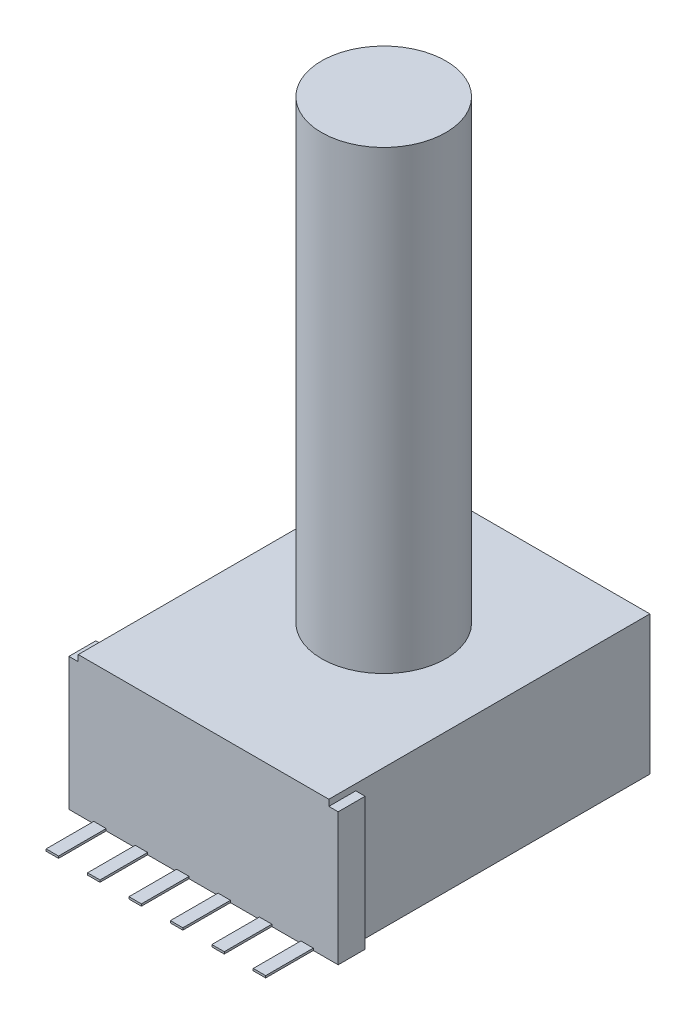
ISO-10303-21;
HEADER;
FILE_DESCRIPTION(('STEP AP214'),'2;1');
FILE_NAME('part.step','',(''),(''),'','','');
FILE_SCHEMA(('AUTOMOTIVE_DESIGN { 1 0 10303 214 1 1 1 1 }'));
ENDSEC;
DATA;
#1=APPLICATION_CONTEXT('core data for automotive mechanical design processes');
#2=APPLICATION_PROTOCOL_DEFINITION('international standard','automotive_design',2000,#1);
#3=PRODUCT_CONTEXT('',#1,'mechanical');
#4=PRODUCT('Part','Part','',(#3));
#5=PRODUCT_RELATED_PRODUCT_CATEGORY('part','',(#4));
#6=PRODUCT_DEFINITION_FORMATION('','',#4);
#7=PRODUCT_DEFINITION_CONTEXT('part definition',#1,'design');
#8=PRODUCT_DEFINITION('design','',#6,#7);
#9=PRODUCT_DEFINITION_SHAPE('','',#8);
#10=(LENGTH_UNIT() NAMED_UNIT(*) SI_UNIT(.MILLI.,.METRE.));
#11=(NAMED_UNIT(*) PLANE_ANGLE_UNIT() SI_UNIT($,.RADIAN.));
#12=(NAMED_UNIT(*) SI_UNIT($,.STERADIAN.) SOLID_ANGLE_UNIT());
#13=UNCERTAINTY_MEASURE_WITH_UNIT(LENGTH_MEASURE(1.E-05),#10,'distance_accuracy_value','');
#14=(GEOMETRIC_REPRESENTATION_CONTEXT(3) GLOBAL_UNCERTAINTY_ASSIGNED_CONTEXT((#13)) GLOBAL_UNIT_ASSIGNED_CONTEXT((#10,
#11,#12)) REPRESENTATION_CONTEXT('',''));
#15=CARTESIAN_POINT('',(0.,0.,0.));
#16=DIRECTION('',(0.,0.,1.));
#17=DIRECTION('',(1.,0.,0.));
#18=AXIS2_PLACEMENT_3D('',#15,#16,#17);
#19=CARTESIAN_POINT('',(6.05,6.7,8.7));
#20=DIRECTION('',(0.,1.,0.));
#21=DIRECTION('',(0.,0.,1.));
#22=AXIS2_PLACEMENT_3D('',#19,#20,#21);
#23=PLANE('',#22);
#24=DIRECTION('',(0.,0.,-1.));
#25=VECTOR('',#24,1.);
#26=CARTESIAN_POINT('',(6.05,6.7,-6.8));
#27=LINE('',#26,#25);
#28=CARTESIAN_POINT('',(6.05,6.7,8.7));
#29=VERTEX_POINT('',#28);
#30=CARTESIAN_POINT('',(6.05,6.7,-6.8));
#31=VERTEX_POINT('',#30);
#32=EDGE_CURVE('E481',#29,#31,#27,.T.);
#33=ORIENTED_EDGE('',*,*,#32,.T.);
#34=DIRECTION('',(-1.,0.,0.));
#35=VECTOR('',#34,1.);
#36=CARTESIAN_POINT('',(-6.05,6.7,-6.8));
#37=LINE('',#36,#35);
#38=CARTESIAN_POINT('',(-6.05,6.7,-6.8));
#39=VERTEX_POINT('',#38);
#40=EDGE_CURVE('E479',#31,#39,#37,.T.);
#41=ORIENTED_EDGE('',*,*,#40,.T.);
#42=DIRECTION('',(0.,0.,1.));
#43=VECTOR('',#42,1.);
#44=CARTESIAN_POINT('',(-6.05,6.7,-6.8));
#45=LINE('',#44,#43);
#46=CARTESIAN_POINT('',(-6.05,6.7,8.7));
#47=VERTEX_POINT('',#46);
#48=EDGE_CURVE('E477',#39,#47,#45,.T.);
#49=ORIENTED_EDGE('',*,*,#48,.T.);
#50=DIRECTION('',(1.,0.,0.));
#51=VECTOR('',#50,1.);
#52=CARTESIAN_POINT('',(-6.05,6.7,8.7));
#53=LINE('',#52,#51);
#54=EDGE_CURVE('E475',#47,#29,#53,.T.);
#55=ORIENTED_EDGE('',*,*,#54,.T.);
#56=EDGE_LOOP('',(#33,#41,#49,#55));
#57=FACE_BOUND('',#56,.T.);
#58=CARTESIAN_POINT('',(0.,6.7,0.));
#59=DIRECTION('',(0.,1.,0.));
#60=DIRECTION('',(0.,0.,1.));
#61=AXIS2_PLACEMENT_3D('',#58,#59,#60);
#62=CIRCLE('',#61,3.);
#63=CARTESIAN_POINT('',(0.,6.7,3.));
#64=VERTEX_POINT('',#63);
#65=EDGE_CURVE('E874',#64,#64,#62,.T.);
#66=ORIENTED_EDGE('',*,*,#65,.F.);
#67=EDGE_LOOP('',(#66));
#68=FACE_BOUND('',#67,.T.);
#69=ADVANCED_FACE('F30',(#57,#68),#23,.T.);
#70=CARTESIAN_POINT('',(-6.05,6.7,8.7));
#71=DIRECTION('',(0.,0.,-1.));
#72=DIRECTION('',(-1.,0.,0.));
#73=AXIS2_PLACEMENT_3D('',#70,#71,#72);
#74=PLANE('',#73);
#75=DIRECTION('',(0.,-1.,0.));
#76=VECTOR('',#75,1.);
#77=CARTESIAN_POINT('',(0.700000000000003,0.1,8.7));
#78=LINE('',#77,#76);
#79=CARTESIAN_POINT('',(0.700000000000002,0.1,8.7));
#80=VERTEX_POINT('',#79);
#81=CARTESIAN_POINT('',(0.700000000000003,0.,8.7));
#82=VERTEX_POINT('',#81);
#83=EDGE_CURVE('E53',#80,#82,#78,.T.);
#84=ORIENTED_EDGE('',*,*,#83,.F.);
#85=DIRECTION('',(-1.,0.,0.));
#86=VECTOR('',#85,1.);
#87=CARTESIAN_POINT('',(1.3,0.1,8.7));
#88=LINE('',#87,#86);
#89=CARTESIAN_POINT('',(1.3,0.1,8.7));
#90=VERTEX_POINT('',#89);
#91=EDGE_CURVE('E48',#90,#80,#88,.T.);
#92=ORIENTED_EDGE('',*,*,#91,.F.);
#93=DIRECTION('',(0.,-1.,0.));
#94=VECTOR('',#93,1.);
#95=CARTESIAN_POINT('',(1.3,0.1,8.7));
#96=LINE('',#95,#94);
#97=CARTESIAN_POINT('',(1.3,0.,8.7));
#98=VERTEX_POINT('',#97);
#99=EDGE_CURVE('E274',#90,#98,#96,.T.);
#100=ORIENTED_EDGE('',*,*,#99,.T.);
#101=DIRECTION('',(1.,0.,0.));
#102=VECTOR('',#101,1.);
#103=CARTESIAN_POINT('',(-6.05,0.,8.7));
#104=LINE('',#103,#102);
#105=CARTESIAN_POINT('',(2.7,0.,8.7));
#106=VERTEX_POINT('',#105);
#107=EDGE_CURVE('E34',#98,#106,#104,.T.);
#108=ORIENTED_EDGE('',*,*,#107,.T.);
#109=DIRECTION('',(0.,-1.,0.));
#110=VECTOR('',#109,1.);
#111=CARTESIAN_POINT('',(2.7,0.1,8.7));
#112=LINE('',#111,#110);
#113=CARTESIAN_POINT('',(2.7,0.1,8.7));
#114=VERTEX_POINT('',#113);
#115=EDGE_CURVE('E314',#114,#106,#112,.T.);
#116=ORIENTED_EDGE('',*,*,#115,.F.);
#117=DIRECTION('',(-1.,0.,0.));
#118=VECTOR('',#117,1.);
#119=CARTESIAN_POINT('',(2.7,0.1,8.7));
#120=LINE('',#119,#118);
#121=CARTESIAN_POINT('',(3.3,0.1,8.7));
#122=VERTEX_POINT('',#121);
#123=EDGE_CURVE('E289',#122,#114,#120,.T.);
#124=ORIENTED_EDGE('',*,*,#123,.F.);
#125=DIRECTION('',(0.,-1.,0.));
#126=VECTOR('',#125,1.);
#127=CARTESIAN_POINT('',(3.3,0.1,8.7));
#128=LINE('',#127,#126);
#129=CARTESIAN_POINT('',(3.3,0.,8.7));
#130=VERTEX_POINT('',#129);
#131=EDGE_CURVE('E300',#122,#130,#128,.T.);
#132=ORIENTED_EDGE('',*,*,#131,.T.);
#133=CARTESIAN_POINT('',(4.7,0.,8.7));
#134=VERTEX_POINT('',#133);
#135=EDGE_CURVE('E459',#130,#134,#104,.T.);
#136=ORIENTED_EDGE('',*,*,#135,.T.);
#137=DIRECTION('',(0.,-1.,0.));
#138=VECTOR('',#137,1.);
#139=CARTESIAN_POINT('',(4.7,0.1,8.7));
#140=LINE('',#139,#138);
#141=CARTESIAN_POINT('',(4.7,0.1,8.7));
#142=VERTEX_POINT('',#141);
#143=EDGE_CURVE('E343',#142,#134,#140,.T.);
#144=ORIENTED_EDGE('',*,*,#143,.F.);
#145=DIRECTION('',(-1.,0.,0.));
#146=VECTOR('',#145,1.);
#147=CARTESIAN_POINT('',(4.7,0.1,8.7));
#148=LINE('',#147,#146);
#149=CARTESIAN_POINT('',(5.3,0.1,8.7));
#150=VERTEX_POINT('',#149);
#151=EDGE_CURVE('E318',#150,#142,#148,.T.);
#152=ORIENTED_EDGE('',*,*,#151,.F.);
#153=DIRECTION('',(0.,-1.,0.));
#154=VECTOR('',#153,1.);
#155=CARTESIAN_POINT('',(5.3,0.1,8.7));
#156=LINE('',#155,#154);
#157=CARTESIAN_POINT('',(5.3,0.,8.7));
#158=VERTEX_POINT('',#157);
#159=EDGE_CURVE('E329',#150,#158,#156,.T.);
#160=ORIENTED_EDGE('',*,*,#159,.T.);
#161=CARTESIAN_POINT('',(6.5,0.,8.7));
#162=VERTEX_POINT('',#161);
#163=EDGE_CURVE('E458',#158,#162,#104,.T.);
#164=ORIENTED_EDGE('',*,*,#163,.T.);
#165=DIRECTION('',(0.,-1.,0.));
#166=VECTOR('',#165,1.);
#167=CARTESIAN_POINT('',(6.5,6.4,8.7));
#168=LINE('',#167,#166);
#169=CARTESIAN_POINT('',(6.5,6.4,8.7));
#170=VERTEX_POINT('',#169);
#171=EDGE_CURVE('E497',#170,#162,#168,.T.);
#172=ORIENTED_EDGE('',*,*,#171,.F.);
#173=DIRECTION('',(1.,0.,0.));
#174=VECTOR('',#173,1.);
#175=CARTESIAN_POINT('',(-6.5,6.4,8.70000000000001));
#176=LINE('',#175,#174);
#177=CARTESIAN_POINT('',(6.05,6.4,8.7));
#178=VERTEX_POINT('',#177);
#179=EDGE_CURVE('E525',#178,#170,#176,.T.);
#180=ORIENTED_EDGE('',*,*,#179,.F.);
#181=DIRECTION('',(0.,-1.,0.));
#182=VECTOR('',#181,1.);
#183=CARTESIAN_POINT('',(6.05,6.7,8.7));
#184=LINE('',#183,#182);
#185=EDGE_CURVE('E449',#29,#178,#184,.T.);
#186=ORIENTED_EDGE('',*,*,#185,.F.);
#187=ORIENTED_EDGE('',*,*,#54,.F.);
#188=DIRECTION('',(0.,-1.,0.));
#189=VECTOR('',#188,1.);
#190=CARTESIAN_POINT('',(-6.05,6.7,8.7));
#191=LINE('',#190,#189);
#192=CARTESIAN_POINT('',(-6.05,6.4,8.7));
#193=VERTEX_POINT('',#192);
#194=EDGE_CURVE('E911',#47,#193,#191,.T.);
#195=ORIENTED_EDGE('',*,*,#194,.T.);
#196=CARTESIAN_POINT('',(-6.5,6.4,8.70000000000001));
#197=VERTEX_POINT('',#196);
#198=EDGE_CURVE('E522',#197,#193,#176,.T.);
#199=ORIENTED_EDGE('',*,*,#198,.F.);
#200=DIRECTION('',(0.,-1.,0.));
#201=VECTOR('',#200,1.);
#202=CARTESIAN_POINT('',(-6.5,6.4,8.70000000000001));
#203=LINE('',#202,#201);
#204=CARTESIAN_POINT('',(-6.5,0.,8.70000000000001));
#205=VERTEX_POINT('',#204);
#206=EDGE_CURVE('E494',#197,#205,#203,.T.);
#207=ORIENTED_EDGE('',*,*,#206,.T.);
#208=CARTESIAN_POINT('',(-5.3,0.,8.7));
#209=VERTEX_POINT('',#208);
#210=EDGE_CURVE('E455',#205,#209,#104,.T.);
#211=ORIENTED_EDGE('',*,*,#210,.T.);
#212=DIRECTION('',(0.,-1.,0.));
#213=VECTOR('',#212,1.);
#214=CARTESIAN_POINT('',(-5.3,0.1,8.7));
#215=LINE('',#214,#213);
#216=CARTESIAN_POINT('',(-5.3,0.1,8.7));
#217=VERTEX_POINT('',#216);
#218=EDGE_CURVE('E369',#217,#209,#215,.T.);
#219=ORIENTED_EDGE('',*,*,#218,.F.);
#220=DIRECTION('',(-1.,0.,0.));
#221=VECTOR('',#220,1.);
#222=CARTESIAN_POINT('',(-4.7,0.1,8.7));
#223=LINE('',#222,#221);
#224=CARTESIAN_POINT('',(-4.7,0.1,8.7));
#225=VERTEX_POINT('',#224);
#226=EDGE_CURVE('E350',#225,#217,#223,.T.);
#227=ORIENTED_EDGE('',*,*,#226,.F.);
#228=DIRECTION('',(0.,-1.,0.));
#229=VECTOR('',#228,1.);
#230=CARTESIAN_POINT('',(-4.7,0.1,8.7));
#231=LINE('',#230,#229);
#232=CARTESIAN_POINT('',(-4.7,0.,8.7));
#233=VERTEX_POINT('',#232);
#234=EDGE_CURVE('E372',#225,#233,#231,.T.);
#235=ORIENTED_EDGE('',*,*,#234,.T.);
#236=CARTESIAN_POINT('',(-3.3,0.,8.7));
#237=VERTEX_POINT('',#236);
#238=EDGE_CURVE('E442',#233,#237,#104,.T.);
#239=ORIENTED_EDGE('',*,*,#238,.T.);
#240=DIRECTION('',(0.,-1.,0.));
#241=VECTOR('',#240,1.);
#242=CARTESIAN_POINT('',(-3.3,0.1,8.7));
#243=LINE('',#242,#241);
#244=CARTESIAN_POINT('',(-3.3,0.1,8.7));
#245=VERTEX_POINT('',#244);
#246=EDGE_CURVE('E398',#245,#237,#243,.T.);
#247=ORIENTED_EDGE('',*,*,#246,.F.);
#248=DIRECTION('',(-1.,0.,0.));
#249=VECTOR('',#248,1.);
#250=CARTESIAN_POINT('',(-2.7,0.1,8.7));
#251=LINE('',#250,#249);
#252=CARTESIAN_POINT('',(-2.7,0.1,8.7));
#253=VERTEX_POINT('',#252);
#254=EDGE_CURVE('E379',#253,#245,#251,.T.);
#255=ORIENTED_EDGE('',*,*,#254,.F.);
#256=DIRECTION('',(0.,-1.,0.));
#257=VECTOR('',#256,1.);
#258=CARTESIAN_POINT('',(-2.7,0.1,8.7));
#259=LINE('',#258,#257);
#260=CARTESIAN_POINT('',(-2.7,0.,8.7));
#261=VERTEX_POINT('',#260);
#262=EDGE_CURVE('E401',#253,#261,#259,.T.);
#263=ORIENTED_EDGE('',*,*,#262,.T.);
#264=CARTESIAN_POINT('',(-1.3,0.,8.7));
#265=VERTEX_POINT('',#264);
#266=EDGE_CURVE('E440',#261,#265,#104,.T.);
#267=ORIENTED_EDGE('',*,*,#266,.T.);
#268=DIRECTION('',(0.,-1.,0.));
#269=VECTOR('',#268,1.);
#270=CARTESIAN_POINT('',(-1.3,0.1,8.7));
#271=LINE('',#270,#269);
#272=CARTESIAN_POINT('',(-1.3,0.1,8.7));
#273=VERTEX_POINT('',#272);
#274=EDGE_CURVE('E415',#273,#265,#271,.T.);
#275=ORIENTED_EDGE('',*,*,#274,.F.);
#276=DIRECTION('',(-1.,0.,0.));
#277=VECTOR('',#276,1.);
#278=CARTESIAN_POINT('',(-1.3,0.1,8.7));
#279=LINE('',#278,#277);
#280=CARTESIAN_POINT('',(-0.699999999999999,0.1,8.7));
#281=VERTEX_POINT('',#280);
#282=EDGE_CURVE('E413',#281,#273,#279,.T.);
#283=ORIENTED_EDGE('',*,*,#282,.F.);
#284=DIRECTION('',(0.,-1.,0.));
#285=VECTOR('',#284,1.);
#286=CARTESIAN_POINT('',(-0.699999999999999,0.1,8.7));
#287=LINE('',#286,#285);
#288=CARTESIAN_POINT('',(-0.699999999999999,0.,8.7));
#289=VERTEX_POINT('',#288);
#290=EDGE_CURVE('E423',#281,#289,#287,.T.);
#291=ORIENTED_EDGE('',*,*,#290,.T.);
#292=EDGE_CURVE('E427',#289,#82,#104,.T.);
#293=ORIENTED_EDGE('',*,*,#292,.T.);
#294=EDGE_LOOP('',(#84,#92,#100,#108,#116,#124,#132,#136,#144,#152,#160,#164,#172,#180,#186,
#187,#195,#199,#207,#211,#219,#227,#235,#239,#247,#255,#263,#267,#275,#283,#291,#293));
#295=FACE_BOUND('',#294,.T.);
#296=ADVANCED_FACE('F541',(#295),#74,.F.);
#297=CARTESIAN_POINT('',(6.05,6.7,-6.8));
#298=DIRECTION('',(-1.,0.,0.));
#299=DIRECTION('',(0.,0.,1.));
#300=AXIS2_PLACEMENT_3D('',#297,#298,#299);
#301=PLANE('',#300);
#302=DIRECTION('',(0.,1.,0.));
#303=VECTOR('',#302,1.);
#304=CARTESIAN_POINT('',(6.05,6.7,7.4));
#305=LINE('',#304,#303);
#306=CARTESIAN_POINT('',(6.05,0.,7.4));
#307=VERTEX_POINT('',#306);
#308=CARTESIAN_POINT('',(6.05,6.4,7.4));
#309=VERTEX_POINT('',#308);
#310=EDGE_CURVE('E489',#307,#309,#305,.T.);
#311=ORIENTED_EDGE('',*,*,#310,.F.);
#312=DIRECTION('',(0.,0.,-1.));
#313=VECTOR('',#312,1.);
#314=CARTESIAN_POINT('',(6.05,0.,-6.8));
#315=LINE('',#314,#313);
#316=CARTESIAN_POINT('',(6.05,0.,-6.8));
#317=VERTEX_POINT('',#316);
#318=EDGE_CURVE('E468',#307,#317,#315,.T.);
#319=ORIENTED_EDGE('',*,*,#318,.T.);
#320=DIRECTION('',(0.,-1.,0.));
#321=VECTOR('',#320,1.);
#322=CARTESIAN_POINT('',(6.05,6.7,-6.8));
#323=LINE('',#322,#321);
#324=EDGE_CURVE('E11',#31,#317,#323,.T.);
#325=ORIENTED_EDGE('',*,*,#324,.F.);
#326=ORIENTED_EDGE('',*,*,#32,.F.);
#327=ORIENTED_EDGE('',*,*,#185,.T.);
#328=DIRECTION('',(0.,0.,1.));
#329=VECTOR('',#328,1.);
#330=CARTESIAN_POINT('',(6.05,6.4,-6.8));
#331=LINE('',#330,#329);
#332=EDGE_CURVE('E472',#309,#178,#331,.T.);
#333=ORIENTED_EDGE('',*,*,#332,.F.);
#334=EDGE_LOOP('',(#311,#319,#325,#326,#327,#333));
#335=FACE_BOUND('',#334,.T.);
#336=ADVANCED_FACE('F32',(#335),#301,.F.);
#337=CARTESIAN_POINT('',(-6.05,6.7,-6.8));
#338=DIRECTION('',(1.,0.,0.));
#339=DIRECTION('',(0.,0.,-1.));
#340=AXIS2_PLACEMENT_3D('',#337,#338,#339);
#341=PLANE('',#340);
#342=DIRECTION('',(0.,-1.,0.));
#343=VECTOR('',#342,1.);
#344=CARTESIAN_POINT('',(-6.05,6.7,7.4));
#345=LINE('',#344,#343);
#346=CARTESIAN_POINT('',(-6.05,6.4,7.4));
#347=VERTEX_POINT('',#346);
#348=CARTESIAN_POINT('',(-6.05,0.,7.4));
#349=VERTEX_POINT('',#348);
#350=EDGE_CURVE('E492',#347,#349,#345,.T.);
#351=ORIENTED_EDGE('',*,*,#350,.F.);
#352=DIRECTION('',(0.,0.,-1.));
#353=VECTOR('',#352,1.);
#354=CARTESIAN_POINT('',(-6.05,6.4,-6.8));
#355=LINE('',#354,#353);
#356=EDGE_CURVE('E486',#193,#347,#355,.T.);
#357=ORIENTED_EDGE('',*,*,#356,.F.);
#358=ORIENTED_EDGE('',*,*,#194,.F.);
#359=ORIENTED_EDGE('',*,*,#48,.F.);
#360=DIRECTION('',(0.,-1.,0.));
#361=VECTOR('',#360,1.);
#362=CARTESIAN_POINT('',(-6.05,6.7,-6.8));
#363=LINE('',#362,#361);
#364=CARTESIAN_POINT('',(-6.05,0.,-6.8));
#365=VERTEX_POINT('',#364);
#366=EDGE_CURVE('E40',#39,#365,#363,.T.);
#367=ORIENTED_EDGE('',*,*,#366,.T.);
#368=DIRECTION('',(0.,0.,1.));
#369=VECTOR('',#368,1.);
#370=CARTESIAN_POINT('',(-6.05,0.,-6.8));
#371=LINE('',#370,#369);
#372=EDGE_CURVE('E447',#365,#349,#371,.T.);
#373=ORIENTED_EDGE('',*,*,#372,.T.);
#374=EDGE_LOOP('',(#351,#357,#358,#359,#367,#373));
#375=FACE_BOUND('',#374,.T.);
#376=ADVANCED_FACE('F593',(#375),#341,.F.);
#377=CARTESIAN_POINT('',(-6.05,6.7,-6.8));
#378=DIRECTION('',(0.,0.,1.));
#379=DIRECTION('',(1.,0.,0.));
#380=AXIS2_PLACEMENT_3D('',#377,#378,#379);
#381=PLANE('',#380);
#382=DIRECTION('',(-1.,0.,0.));
#383=VECTOR('',#382,1.);
#384=CARTESIAN_POINT('',(-6.05,0.,-6.8));
#385=LINE('',#384,#383);
#386=EDGE_CURVE('E463',#317,#365,#385,.T.);
#387=ORIENTED_EDGE('',*,*,#386,.T.);
#388=ORIENTED_EDGE('',*,*,#366,.F.);
#389=ORIENTED_EDGE('',*,*,#40,.F.);
#390=ORIENTED_EDGE('',*,*,#324,.T.);
#391=EDGE_LOOP('',(#387,#388,#389,#390));
#392=FACE_BOUND('',#391,.T.);
#393=ADVANCED_FACE('F591',(#392),#381,.F.);
#394=CARTESIAN_POINT('',(6.05,0.,8.7));
#395=DIRECTION('',(0.,1.,0.));
#396=DIRECTION('',(0.,0.,1.));
#397=AXIS2_PLACEMENT_3D('',#394,#395,#396);
#398=PLANE('',#397);
#399=ORIENTED_EDGE('',*,*,#210,.F.);
#400=DIRECTION('',(0.,0.,1.));
#401=VECTOR('',#400,1.);
#402=CARTESIAN_POINT('',(-6.5,0.,8.70000000000001));
#403=LINE('',#402,#401);
#404=CARTESIAN_POINT('',(-6.5,0.,7.4));
#405=VERTEX_POINT('',#404);
#406=EDGE_CURVE('E513',#405,#205,#403,.T.);
#407=ORIENTED_EDGE('',*,*,#406,.F.);
#408=DIRECTION('',(-1.,0.,0.));
#409=VECTOR('',#408,1.);
#410=CARTESIAN_POINT('',(-6.5,0.,7.4));
#411=LINE('',#410,#409);
#412=EDGE_CURVE('E510',#349,#405,#411,.T.);
#413=ORIENTED_EDGE('',*,*,#412,.F.);
#414=ORIENTED_EDGE('',*,*,#372,.F.);
#415=ORIENTED_EDGE('',*,*,#386,.F.);
#416=ORIENTED_EDGE('',*,*,#318,.F.);
#417=CARTESIAN_POINT('',(6.5,0.,7.4));
#418=VERTEX_POINT('',#417);
#419=EDGE_CURVE('E506',#418,#307,#411,.T.);
#420=ORIENTED_EDGE('',*,*,#419,.F.);
#421=DIRECTION('',(0.,0.,-1.));
#422=VECTOR('',#421,1.);
#423=CARTESIAN_POINT('',(6.5,0.,8.7));
#424=LINE('',#423,#422);
#425=EDGE_CURVE('E511',#162,#418,#424,.T.);
#426=ORIENTED_EDGE('',*,*,#425,.F.);
#427=ORIENTED_EDGE('',*,*,#163,.F.);
#428=DIRECTION('',(0.,0.,-1.));
#429=VECTOR('',#428,1.);
#430=CARTESIAN_POINT('',(5.3,0.,8.7));
#431=LINE('',#430,#429);
#432=CARTESIAN_POINT('',(5.3,0.,11.));
#433=VERTEX_POINT('',#432);
#434=EDGE_CURVE('E322',#433,#158,#431,.T.);
#435=ORIENTED_EDGE('',*,*,#434,.F.);
#436=DIRECTION('',(1.,0.,0.));
#437=VECTOR('',#436,1.);
#438=CARTESIAN_POINT('',(4.7,0.,11.));
#439=LINE('',#438,#437);
#440=CARTESIAN_POINT('',(4.7,0.,11.));
#441=VERTEX_POINT('',#440);
#442=EDGE_CURVE('E331',#441,#433,#439,.T.);
#443=ORIENTED_EDGE('',*,*,#442,.F.);
#444=DIRECTION('',(0.,0.,1.));
#445=VECTOR('',#444,1.);
#446=CARTESIAN_POINT('',(4.7,0.,8.7));
#447=LINE('',#446,#445);
#448=EDGE_CURVE('E317',#134,#441,#447,.T.);
#449=ORIENTED_EDGE('',*,*,#448,.F.);
#450=ORIENTED_EDGE('',*,*,#135,.F.);
#451=DIRECTION('',(0.,0.,-1.));
#452=VECTOR('',#451,1.);
#453=CARTESIAN_POINT('',(3.3,0.,8.7));
#454=LINE('',#453,#452);
#455=CARTESIAN_POINT('',(3.3,0.,11.));
#456=VERTEX_POINT('',#455);
#457=EDGE_CURVE('E293',#456,#130,#454,.T.);
#458=ORIENTED_EDGE('',*,*,#457,.F.);
#459=DIRECTION('',(1.,0.,0.));
#460=VECTOR('',#459,1.);
#461=CARTESIAN_POINT('',(2.7,0.,11.));
#462=LINE('',#461,#460);
#463=CARTESIAN_POINT('',(2.7,0.,11.));
#464=VERTEX_POINT('',#463);
#465=EDGE_CURVE('E302',#464,#456,#462,.T.);
#466=ORIENTED_EDGE('',*,*,#465,.F.);
#467=DIRECTION('',(0.,0.,1.));
#468=VECTOR('',#467,1.);
#469=CARTESIAN_POINT('',(2.7,0.,8.7));
#470=LINE('',#469,#468);
#471=EDGE_CURVE('E288',#106,#464,#470,.T.);
#472=ORIENTED_EDGE('',*,*,#471,.F.);
#473=ORIENTED_EDGE('',*,*,#107,.F.);
#474=DIRECTION('',(0.,0.,-1.));
#475=VECTOR('',#474,1.);
#476=CARTESIAN_POINT('',(1.3,0.,8.7));
#477=LINE('',#476,#475);
#478=CARTESIAN_POINT('',(1.3,0.,11.));
#479=VERTEX_POINT('',#478);
#480=EDGE_CURVE('E282',#479,#98,#477,.T.);
#481=ORIENTED_EDGE('',*,*,#480,.F.);
#482=DIRECTION('',(1.,0.,0.));
#483=VECTOR('',#482,1.);
#484=CARTESIAN_POINT('',(1.3,0.,11.));
#485=LINE('',#484,#483);
#486=CARTESIAN_POINT('',(0.700000000000003,0.,11.));
#487=VERTEX_POINT('',#486);
#488=EDGE_CURVE('E279',#487,#479,#485,.T.);
#489=ORIENTED_EDGE('',*,*,#488,.F.);
#490=DIRECTION('',(0.,0.,1.));
#491=VECTOR('',#490,1.);
#492=CARTESIAN_POINT('',(0.700000000000003,0.,8.7));
#493=LINE('',#492,#491);
#494=EDGE_CURVE('E264',#82,#487,#493,.T.);
#495=ORIENTED_EDGE('',*,*,#494,.F.);
#496=ORIENTED_EDGE('',*,*,#292,.F.);
#497=DIRECTION('',(0.,0.,-1.));
#498=VECTOR('',#497,1.);
#499=CARTESIAN_POINT('',(-0.699999999999999,0.,8.7));
#500=LINE('',#499,#498);
#501=CARTESIAN_POINT('',(-0.699999999999999,0.,11.));
#502=VERTEX_POINT('',#501);
#503=EDGE_CURVE('E409',#502,#289,#500,.T.);
#504=ORIENTED_EDGE('',*,*,#503,.F.);
#505=DIRECTION('',(1.,0.,0.));
#506=VECTOR('',#505,1.);
#507=CARTESIAN_POINT('',(-1.3,0.,11.));
#508=LINE('',#507,#506);
#509=CARTESIAN_POINT('',(-1.3,0.,11.));
#510=VERTEX_POINT('',#509);
#511=EDGE_CURVE('E416',#510,#502,#508,.T.);
#512=ORIENTED_EDGE('',*,*,#511,.F.);
#513=DIRECTION('',(0.,0.,1.));
#514=VECTOR('',#513,1.);
#515=CARTESIAN_POINT('',(-1.3,0.,8.7));
#516=LINE('',#515,#514);
#517=EDGE_CURVE('E404',#265,#510,#516,.T.);
#518=ORIENTED_EDGE('',*,*,#517,.F.);
#519=ORIENTED_EDGE('',*,*,#266,.F.);
#520=DIRECTION('',(0.,0.,-1.));
#521=VECTOR('',#520,1.);
#522=CARTESIAN_POINT('',(-2.7,0.,8.7));
#523=LINE('',#522,#521);
#524=CARTESIAN_POINT('',(-2.7,0.,11.));
#525=VERTEX_POINT('',#524);
#526=EDGE_CURVE('E375',#525,#261,#523,.T.);
#527=ORIENTED_EDGE('',*,*,#526,.F.);
#528=DIRECTION('',(1.,0.,0.));
#529=VECTOR('',#528,1.);
#530=CARTESIAN_POINT('',(-2.7,0.,11.));
#531=LINE('',#530,#529);
#532=CARTESIAN_POINT('',(-3.3,0.,11.));
#533=VERTEX_POINT('',#532);
#534=EDGE_CURVE('E380',#533,#525,#531,.T.);
#535=ORIENTED_EDGE('',*,*,#534,.F.);
#536=DIRECTION('',(0.,0.,1.));
#537=VECTOR('',#536,1.);
#538=CARTESIAN_POINT('',(-3.3,0.,8.7));
#539=LINE('',#538,#537);
#540=EDGE_CURVE('E390',#237,#533,#539,.T.);
#541=ORIENTED_EDGE('',*,*,#540,.F.);
#542=ORIENTED_EDGE('',*,*,#238,.F.);
#543=DIRECTION('',(0.,0.,-1.));
#544=VECTOR('',#543,1.);
#545=CARTESIAN_POINT('',(-4.7,0.,8.7));
#546=LINE('',#545,#544);
#547=CARTESIAN_POINT('',(-4.7,0.,11.));
#548=VERTEX_POINT('',#547);
#549=EDGE_CURVE('E346',#548,#233,#546,.T.);
#550=ORIENTED_EDGE('',*,*,#549,.F.);
#551=DIRECTION('',(1.,0.,0.));
#552=VECTOR('',#551,1.);
#553=CARTESIAN_POINT('',(-4.7,0.,11.));
#554=LINE('',#553,#552);
#555=CARTESIAN_POINT('',(-5.3,0.,11.));
#556=VERTEX_POINT('',#555);
#557=EDGE_CURVE('E351',#556,#548,#554,.T.);
#558=ORIENTED_EDGE('',*,*,#557,.F.);
#559=DIRECTION('',(0.,0.,1.));
#560=VECTOR('',#559,1.);
#561=CARTESIAN_POINT('',(-5.3,0.,8.7));
#562=LINE('',#561,#560);
#563=EDGE_CURVE('E361',#209,#556,#562,.T.);
#564=ORIENTED_EDGE('',*,*,#563,.F.);
#565=EDGE_LOOP('',(#399,#407,#413,#414,#415,#416,#420,#426,#427,#435,#443,#449,#450,#458,#466,
#472,#473,#481,#489,#495,#496,#504,#512,#518,#519,#527,#535,#541,#542,#550,#558,#564));
#566=FACE_BOUND('',#565,.T.);
#567=ADVANCED_FACE('F539',(#566),#398,.F.);
#568=CARTESIAN_POINT('',(-6.5,6.4,8.70000000000001));
#569=DIRECTION('',(1.,0.,0.));
#570=DIRECTION('',(0.,0.,-1.));
#571=AXIS2_PLACEMENT_3D('',#568,#569,#570);
#572=PLANE('',#571);
#573=ORIENTED_EDGE('',*,*,#406,.T.);
#574=ORIENTED_EDGE('',*,*,#206,.F.);
#575=DIRECTION('',(0.,0.,1.));
#576=VECTOR('',#575,1.);
#577=CARTESIAN_POINT('',(-6.5,6.4,8.70000000000001));
#578=LINE('',#577,#576);
#579=CARTESIAN_POINT('',(-6.5,6.4,7.4));
#580=VERTEX_POINT('',#579);
#581=EDGE_CURVE('E509',#580,#197,#578,.T.);
#582=ORIENTED_EDGE('',*,*,#581,.F.);
#583=DIRECTION('',(0.,-1.,0.));
#584=VECTOR('',#583,1.);
#585=CARTESIAN_POINT('',(-6.5,6.4,7.4));
#586=LINE('',#585,#584);
#587=EDGE_CURVE('E502',#580,#405,#586,.T.);
#588=ORIENTED_EDGE('',*,*,#587,.T.);
#589=EDGE_LOOP('',(#573,#574,#582,#588));
#590=FACE_BOUND('',#589,.T.);
#591=ADVANCED_FACE('F588',(#590),#572,.F.);
#592=CARTESIAN_POINT('',(-6.5,6.4,7.4));
#593=DIRECTION('',(0.,-1.,0.));
#594=DIRECTION('',(0.,0.,-1.));
#595=AXIS2_PLACEMENT_3D('',#592,#593,#594);
#596=PLANE('',#595);
#597=ORIENTED_EDGE('',*,*,#198,.T.);
#598=ORIENTED_EDGE('',*,*,#356,.T.);
#599=DIRECTION('',(-1.,0.,0.));
#600=VECTOR('',#599,1.);
#601=CARTESIAN_POINT('',(-6.5,6.4,7.4));
#602=LINE('',#601,#600);
#603=EDGE_CURVE('E519',#347,#580,#602,.T.);
#604=ORIENTED_EDGE('',*,*,#603,.T.);
#605=ORIENTED_EDGE('',*,*,#581,.T.);
#606=EDGE_LOOP('',(#597,#598,#604,#605));
#607=FACE_BOUND('',#606,.T.);
#608=ADVANCED_FACE('F614',(#607),#596,.F.);
#609=CARTESIAN_POINT('',(-6.5,6.4,7.4));
#610=DIRECTION('',(0.,0.,1.));
#611=DIRECTION('',(1.,0.,0.));
#612=AXIS2_PLACEMENT_3D('',#609,#610,#611);
#613=PLANE('',#612);
#614=ORIENTED_EDGE('',*,*,#603,.F.);
#615=ORIENTED_EDGE('',*,*,#350,.T.);
#616=ORIENTED_EDGE('',*,*,#412,.T.);
#617=ORIENTED_EDGE('',*,*,#587,.F.);
#618=EDGE_LOOP('',(#614,#615,#616,#617));
#619=FACE_BOUND('',#618,.T.);
#620=ADVANCED_FACE('F621',(#619),#613,.F.);
#621=CARTESIAN_POINT('',(6.5,6.4,7.4));
#622=VERTEX_POINT('',#621);
#623=EDGE_CURVE('E505',#622,#309,#602,.T.);
#624=ORIENTED_EDGE('',*,*,#623,.T.);
#625=ORIENTED_EDGE('',*,*,#332,.T.);
#626=ORIENTED_EDGE('',*,*,#179,.T.);
#627=DIRECTION('',(0.,0.,-1.));
#628=VECTOR('',#627,1.);
#629=CARTESIAN_POINT('',(6.5,6.4,8.7));
#630=LINE('',#629,#628);
#631=EDGE_CURVE('E520',#170,#622,#630,.T.);
#632=ORIENTED_EDGE('',*,*,#631,.T.);
#633=EDGE_LOOP('',(#624,#625,#626,#632));
#634=FACE_BOUND('',#633,.T.);
#635=ADVANCED_FACE('F624',(#634),#596,.F.);
#636=ORIENTED_EDGE('',*,*,#419,.T.);
#637=ORIENTED_EDGE('',*,*,#310,.T.);
#638=ORIENTED_EDGE('',*,*,#623,.F.);
#639=DIRECTION('',(0.,-1.,0.));
#640=VECTOR('',#639,1.);
#641=CARTESIAN_POINT('',(6.5,6.4,7.4));
#642=LINE('',#641,#640);
#643=EDGE_CURVE('E499',#622,#418,#642,.T.);
#644=ORIENTED_EDGE('',*,*,#643,.T.);
#645=EDGE_LOOP('',(#636,#637,#638,#644));
#646=FACE_BOUND('',#645,.T.);
#647=ADVANCED_FACE('F632',(#646),#613,.F.);
#648=CARTESIAN_POINT('',(6.5,6.4,8.7));
#649=DIRECTION('',(-1.,0.,0.));
#650=DIRECTION('',(0.,0.,1.));
#651=AXIS2_PLACEMENT_3D('',#648,#649,#650);
#652=PLANE('',#651);
#653=ORIENTED_EDGE('',*,*,#425,.T.);
#654=ORIENTED_EDGE('',*,*,#643,.F.);
#655=ORIENTED_EDGE('',*,*,#631,.F.);
#656=ORIENTED_EDGE('',*,*,#171,.T.);
#657=EDGE_LOOP('',(#653,#654,#655,#656));
#658=FACE_BOUND('',#657,.T.);
#659=ADVANCED_FACE('F644',(#658),#652,.F.);
#660=CARTESIAN_POINT('',(-1.3,0.1,8.7));
#661=DIRECTION('',(1.,0.,0.));
#662=DIRECTION('',(0.,0.,-1.));
#663=AXIS2_PLACEMENT_3D('',#660,#661,#662);
#664=PLANE('',#663);
#665=ORIENTED_EDGE('',*,*,#517,.T.);
#666=DIRECTION('',(0.,-1.,0.));
#667=VECTOR('',#666,1.);
#668=CARTESIAN_POINT('',(-1.3,0.1,11.));
#669=LINE('',#668,#667);
#670=CARTESIAN_POINT('',(-1.3,0.1,11.));
#671=VERTEX_POINT('',#670);
#672=EDGE_CURVE('E516',#671,#510,#669,.T.);
#673=ORIENTED_EDGE('',*,*,#672,.F.);
#674=DIRECTION('',(0.,0.,1.));
#675=VECTOR('',#674,1.);
#676=CARTESIAN_POINT('',(-1.3,0.1,8.7));
#677=LINE('',#676,#675);
#678=EDGE_CURVE('E405',#273,#671,#677,.T.);
#679=ORIENTED_EDGE('',*,*,#678,.F.);
#680=ORIENTED_EDGE('',*,*,#274,.T.);
#681=EDGE_LOOP('',(#665,#673,#679,#680));
#682=FACE_BOUND('',#681,.T.);
#683=ADVANCED_FACE('F548',(#682),#664,.F.);
#684=CARTESIAN_POINT('',(-1.3,0.1,11.));
#685=DIRECTION('',(0.,0.,-1.));
#686=DIRECTION('',(-1.,0.,0.));
#687=AXIS2_PLACEMENT_3D('',#684,#685,#686);
#688=PLANE('',#687);
#689=ORIENTED_EDGE('',*,*,#511,.T.);
#690=DIRECTION('',(0.,-1.,0.));
#691=VECTOR('',#690,1.);
#692=CARTESIAN_POINT('',(-0.699999999999999,0.1,11.));
#693=LINE('',#692,#691);
#694=CARTESIAN_POINT('',(-0.699999999999999,0.1,11.));
#695=VERTEX_POINT('',#694);
#696=EDGE_CURVE('E420',#695,#502,#693,.T.);
#697=ORIENTED_EDGE('',*,*,#696,.F.);
#698=DIRECTION('',(1.,0.,0.));
#699=VECTOR('',#698,1.);
#700=CARTESIAN_POINT('',(-1.3,0.1,11.));
#701=LINE('',#700,#699);
#702=EDGE_CURVE('E408',#671,#695,#701,.T.);
#703=ORIENTED_EDGE('',*,*,#702,.F.);
#704=ORIENTED_EDGE('',*,*,#672,.T.);
#705=EDGE_LOOP('',(#689,#697,#703,#704));
#706=FACE_BOUND('',#705,.T.);
#707=ADVANCED_FACE('F656',(#706),#688,.F.);
#708=CARTESIAN_POINT('',(-0.699999999999999,0.1,8.7));
#709=DIRECTION('',(-1.,0.,0.));
#710=DIRECTION('',(0.,0.,1.));
#711=AXIS2_PLACEMENT_3D('',#708,#709,#710);
#712=PLANE('',#711);
#713=ORIENTED_EDGE('',*,*,#503,.T.);
#714=ORIENTED_EDGE('',*,*,#290,.F.);
#715=DIRECTION('',(0.,0.,-1.));
#716=VECTOR('',#715,1.);
#717=CARTESIAN_POINT('',(-0.699999999999999,0.1,8.7));
#718=LINE('',#717,#716);
#719=EDGE_CURVE('E411',#695,#281,#718,.T.);
#720=ORIENTED_EDGE('',*,*,#719,.F.);
#721=ORIENTED_EDGE('',*,*,#696,.T.);
#722=EDGE_LOOP('',(#713,#714,#720,#721));
#723=FACE_BOUND('',#722,.T.);
#724=ADVANCED_FACE('F535',(#723),#712,.F.);
#725=CARTESIAN_POINT('',(-1.3,0.1,11.));
#726=DIRECTION('',(0.,1.,0.));
#727=DIRECTION('',(0.,0.,1.));
#728=AXIS2_PLACEMENT_3D('',#725,#726,#727);
#729=PLANE('',#728);
#730=ORIENTED_EDGE('',*,*,#678,.T.);
#731=ORIENTED_EDGE('',*,*,#702,.T.);
#732=ORIENTED_EDGE('',*,*,#719,.T.);
#733=ORIENTED_EDGE('',*,*,#282,.T.);
#734=EDGE_LOOP('',(#730,#731,#732,#733));
#735=FACE_BOUND('',#734,.T.);
#736=ADVANCED_FACE('F546',(#735),#729,.T.);
#737=CARTESIAN_POINT('',(-2.7,0.1,8.7));
#738=DIRECTION('',(-1.,0.,0.));
#739=DIRECTION('',(0.,0.,1.));
#740=AXIS2_PLACEMENT_3D('',#737,#738,#739);
#741=PLANE('',#740);
#742=ORIENTED_EDGE('',*,*,#526,.T.);
#743=ORIENTED_EDGE('',*,*,#262,.F.);
#744=DIRECTION('',(0.,0.,-1.));
#745=VECTOR('',#744,1.);
#746=CARTESIAN_POINT('',(-2.7,0.1,8.7));
#747=LINE('',#746,#745);
#748=CARTESIAN_POINT('',(-2.7,0.1,11.));
#749=VERTEX_POINT('',#748);
#750=EDGE_CURVE('E376',#749,#253,#747,.T.);
#751=ORIENTED_EDGE('',*,*,#750,.F.);
#752=DIRECTION('',(0.,-1.,0.));
#753=VECTOR('',#752,1.);
#754=CARTESIAN_POINT('',(-2.7,0.1,11.));
#755=LINE('',#754,#753);
#756=EDGE_CURVE('E387',#749,#525,#755,.T.);
#757=ORIENTED_EDGE('',*,*,#756,.T.);
#758=EDGE_LOOP('',(#742,#743,#751,#757));
#759=FACE_BOUND('',#758,.T.);
#760=ADVANCED_FACE('F554',(#759),#741,.F.);
#761=CARTESIAN_POINT('',(-3.3,0.1,8.7));
#762=DIRECTION('',(1.,0.,0.));
#763=DIRECTION('',(0.,0.,-1.));
#764=AXIS2_PLACEMENT_3D('',#761,#762,#763);
#765=PLANE('',#764);
#766=ORIENTED_EDGE('',*,*,#540,.T.);
#767=DIRECTION('',(0.,-1.,0.));
#768=VECTOR('',#767,1.);
#769=CARTESIAN_POINT('',(-3.3,0.1,11.));
#770=LINE('',#769,#768);
#771=CARTESIAN_POINT('',(-3.3,0.1,11.));
#772=VERTEX_POINT('',#771);
#773=EDGE_CURVE('E395',#772,#533,#770,.T.);
#774=ORIENTED_EDGE('',*,*,#773,.F.);
#775=DIRECTION('',(0.,0.,1.));
#776=VECTOR('',#775,1.);
#777=CARTESIAN_POINT('',(-3.3,0.1,8.7));
#778=LINE('',#777,#776);
#779=EDGE_CURVE('E383',#245,#772,#778,.T.);
#780=ORIENTED_EDGE('',*,*,#779,.F.);
#781=ORIENTED_EDGE('',*,*,#246,.T.);
#782=EDGE_LOOP('',(#766,#774,#780,#781));
#783=FACE_BOUND('',#782,.T.);
#784=ADVANCED_FACE('F563',(#783),#765,.F.);
#785=CARTESIAN_POINT('',(-2.7,0.1,11.));
#786=DIRECTION('',(0.,0.,-1.));
#787=DIRECTION('',(-1.,0.,0.));
#788=AXIS2_PLACEMENT_3D('',#785,#786,#787);
#789=PLANE('',#788);
#790=ORIENTED_EDGE('',*,*,#534,.T.);
#791=ORIENTED_EDGE('',*,*,#756,.F.);
#792=DIRECTION('',(1.,0.,0.));
#793=VECTOR('',#792,1.);
#794=CARTESIAN_POINT('',(-2.7,0.1,11.));
#795=LINE('',#794,#793);
#796=EDGE_CURVE('E385',#772,#749,#795,.T.);
#797=ORIENTED_EDGE('',*,*,#796,.F.);
#798=ORIENTED_EDGE('',*,*,#773,.T.);
#799=EDGE_LOOP('',(#790,#791,#797,#798));
#800=FACE_BOUND('',#799,.T.);
#801=ADVANCED_FACE('F558',(#800),#789,.F.);
#802=CARTESIAN_POINT('',(-2.7,0.1,11.));
#803=DIRECTION('',(0.,-1.,0.));
#804=DIRECTION('',(0.,0.,-1.));
#805=AXIS2_PLACEMENT_3D('',#802,#803,#804);
#806=PLANE('',#805);
#807=ORIENTED_EDGE('',*,*,#750,.T.);
#808=ORIENTED_EDGE('',*,*,#254,.T.);
#809=ORIENTED_EDGE('',*,*,#779,.T.);
#810=ORIENTED_EDGE('',*,*,#796,.T.);
#811=EDGE_LOOP('',(#807,#808,#809,#810));
#812=FACE_BOUND('',#811,.T.);
#813=ADVANCED_FACE('F566',(#812),#806,.F.);
#814=CARTESIAN_POINT('',(-4.7,0.1,8.7));
#815=DIRECTION('',(-1.,0.,0.));
#816=DIRECTION('',(0.,0.,1.));
#817=AXIS2_PLACEMENT_3D('',#814,#815,#816);
#818=PLANE('',#817);
#819=ORIENTED_EDGE('',*,*,#549,.T.);
#820=ORIENTED_EDGE('',*,*,#234,.F.);
#821=DIRECTION('',(0.,0.,-1.));
#822=VECTOR('',#821,1.);
#823=CARTESIAN_POINT('',(-4.7,0.1,8.7));
#824=LINE('',#823,#822);
#825=CARTESIAN_POINT('',(-4.7,0.1,11.));
#826=VERTEX_POINT('',#825);
#827=EDGE_CURVE('E347',#826,#225,#824,.T.);
#828=ORIENTED_EDGE('',*,*,#827,.F.);
#829=DIRECTION('',(0.,-1.,0.));
#830=VECTOR('',#829,1.);
#831=CARTESIAN_POINT('',(-4.7,0.1,11.));
#832=LINE('',#831,#830);
#833=EDGE_CURVE('E358',#826,#548,#832,.T.);
#834=ORIENTED_EDGE('',*,*,#833,.T.);
#835=EDGE_LOOP('',(#819,#820,#828,#834));
#836=FACE_BOUND('',#835,.T.);
#837=ADVANCED_FACE('F568',(#836),#818,.F.);
#838=CARTESIAN_POINT('',(-5.3,0.1,8.7));
#839=DIRECTION('',(1.,0.,0.));
#840=DIRECTION('',(0.,0.,-1.));
#841=AXIS2_PLACEMENT_3D('',#838,#839,#840);
#842=PLANE('',#841);
#843=ORIENTED_EDGE('',*,*,#563,.T.);
#844=DIRECTION('',(0.,-1.,0.));
#845=VECTOR('',#844,1.);
#846=CARTESIAN_POINT('',(-5.3,0.1,11.));
#847=LINE('',#846,#845);
#848=CARTESIAN_POINT('',(-5.3,0.1,11.));
#849=VERTEX_POINT('',#848);
#850=EDGE_CURVE('E366',#849,#556,#847,.T.);
#851=ORIENTED_EDGE('',*,*,#850,.F.);
#852=DIRECTION('',(0.,0.,1.));
#853=VECTOR('',#852,1.);
#854=CARTESIAN_POINT('',(-5.3,0.1,8.7));
#855=LINE('',#854,#853);
#856=EDGE_CURVE('E354',#217,#849,#855,.T.);
#857=ORIENTED_EDGE('',*,*,#856,.F.);
#858=ORIENTED_EDGE('',*,*,#218,.T.);
#859=EDGE_LOOP('',(#843,#851,#857,#858));
#860=FACE_BOUND('',#859,.T.);
#861=ADVANCED_FACE('F574',(#860),#842,.F.);
#862=CARTESIAN_POINT('',(-4.7,0.1,11.));
#863=DIRECTION('',(0.,0.,-1.));
#864=DIRECTION('',(-1.,0.,0.));
#865=AXIS2_PLACEMENT_3D('',#862,#863,#864);
#866=PLANE('',#865);
#867=ORIENTED_EDGE('',*,*,#557,.T.);
#868=ORIENTED_EDGE('',*,*,#833,.F.);
#869=DIRECTION('',(1.,0.,0.));
#870=VECTOR('',#869,1.);
#871=CARTESIAN_POINT('',(-4.7,0.1,11.));
#872=LINE('',#871,#870);
#873=EDGE_CURVE('E356',#849,#826,#872,.T.);
#874=ORIENTED_EDGE('',*,*,#873,.F.);
#875=ORIENTED_EDGE('',*,*,#850,.T.);
#876=EDGE_LOOP('',(#867,#868,#874,#875));
#877=FACE_BOUND('',#876,.T.);
#878=ADVANCED_FACE('F710',(#877),#866,.F.);
#879=CARTESIAN_POINT('',(-4.7,0.1,11.));
#880=DIRECTION('',(0.,-1.,0.));
#881=DIRECTION('',(0.,0.,-1.));
#882=AXIS2_PLACEMENT_3D('',#879,#880,#881);
#883=PLANE('',#882);
#884=ORIENTED_EDGE('',*,*,#827,.T.);
#885=ORIENTED_EDGE('',*,*,#226,.T.);
#886=ORIENTED_EDGE('',*,*,#856,.T.);
#887=ORIENTED_EDGE('',*,*,#873,.T.);
#888=EDGE_LOOP('',(#884,#885,#886,#887));
#889=FACE_BOUND('',#888,.T.);
#890=ADVANCED_FACE('F720',(#889),#883,.F.);
#891=CARTESIAN_POINT('',(4.7,0.1,8.7));
#892=DIRECTION('',(1.,0.,0.));
#893=DIRECTION('',(0.,0.,-1.));
#894=AXIS2_PLACEMENT_3D('',#891,#892,#893);
#895=PLANE('',#894);
#896=ORIENTED_EDGE('',*,*,#448,.T.);
#897=DIRECTION('',(0.,-1.,0.));
#898=VECTOR('',#897,1.);
#899=CARTESIAN_POINT('',(4.7,0.1,11.));
#900=LINE('',#899,#898);
#901=CARTESIAN_POINT('',(4.7,0.1,11.));
#902=VERTEX_POINT('',#901);
#903=EDGE_CURVE('E340',#902,#441,#900,.T.);
#904=ORIENTED_EDGE('',*,*,#903,.F.);
#905=DIRECTION('',(0.,0.,1.));
#906=VECTOR('',#905,1.);
#907=CARTESIAN_POINT('',(4.7,0.1,8.7));
#908=LINE('',#907,#906);
#909=EDGE_CURVE('E321',#142,#902,#908,.T.);
#910=ORIENTED_EDGE('',*,*,#909,.F.);
#911=ORIENTED_EDGE('',*,*,#143,.T.);
#912=EDGE_LOOP('',(#896,#904,#910,#911));
#913=FACE_BOUND('',#912,.T.);
#914=ADVANCED_FACE('F730',(#913),#895,.F.);
#915=CARTESIAN_POINT('',(4.7,0.1,11.));
#916=DIRECTION('',(0.,0.,-1.));
#917=DIRECTION('',(-1.,0.,0.));
#918=AXIS2_PLACEMENT_3D('',#915,#916,#917);
#919=PLANE('',#918);
#920=ORIENTED_EDGE('',*,*,#442,.T.);
#921=DIRECTION('',(0.,-1.,0.));
#922=VECTOR('',#921,1.);
#923=CARTESIAN_POINT('',(5.3,0.1,11.));
#924=LINE('',#923,#922);
#925=CARTESIAN_POINT('',(5.3,0.1,11.));
#926=VERTEX_POINT('',#925);
#927=EDGE_CURVE('E337',#926,#433,#924,.T.);
#928=ORIENTED_EDGE('',*,*,#927,.F.);
#929=DIRECTION('',(1.,0.,0.));
#930=VECTOR('',#929,1.);
#931=CARTESIAN_POINT('',(4.7,0.1,11.));
#932=LINE('',#931,#930);
#933=EDGE_CURVE('E324',#902,#926,#932,.T.);
#934=ORIENTED_EDGE('',*,*,#933,.F.);
#935=ORIENTED_EDGE('',*,*,#903,.T.);
#936=EDGE_LOOP('',(#920,#928,#934,#935));
#937=FACE_BOUND('',#936,.T.);
#938=ADVANCED_FACE('F740',(#937),#919,.F.);
#939=CARTESIAN_POINT('',(5.3,0.1,8.7));
#940=DIRECTION('',(-1.,0.,0.));
#941=DIRECTION('',(0.,0.,1.));
#942=AXIS2_PLACEMENT_3D('',#939,#940,#941);
#943=PLANE('',#942);
#944=ORIENTED_EDGE('',*,*,#434,.T.);
#945=ORIENTED_EDGE('',*,*,#159,.F.);
#946=DIRECTION('',(0.,0.,-1.));
#947=VECTOR('',#946,1.);
#948=CARTESIAN_POINT('',(5.3,0.1,8.7));
#949=LINE('',#948,#947);
#950=EDGE_CURVE('E326',#926,#150,#949,.T.);
#951=ORIENTED_EDGE('',*,*,#950,.F.);
#952=ORIENTED_EDGE('',*,*,#927,.T.);
#953=EDGE_LOOP('',(#944,#945,#951,#952));
#954=FACE_BOUND('',#953,.T.);
#955=ADVANCED_FACE('F750',(#954),#943,.F.);
#956=CARTESIAN_POINT('',(5.3,0.1,8.7));
#957=DIRECTION('',(0.,-1.,0.));
#958=DIRECTION('',(0.,0.,-1.));
#959=AXIS2_PLACEMENT_3D('',#956,#957,#958);
#960=PLANE('',#959);
#961=ORIENTED_EDGE('',*,*,#151,.T.);
#962=ORIENTED_EDGE('',*,*,#909,.T.);
#963=ORIENTED_EDGE('',*,*,#933,.T.);
#964=ORIENTED_EDGE('',*,*,#950,.T.);
#965=EDGE_LOOP('',(#961,#962,#963,#964));
#966=FACE_BOUND('',#965,.T.);
#967=ADVANCED_FACE('F760',(#966),#960,.F.);
#968=CARTESIAN_POINT('',(2.7,0.1,8.7));
#969=DIRECTION('',(1.,0.,0.));
#970=DIRECTION('',(0.,0.,-1.));
#971=AXIS2_PLACEMENT_3D('',#968,#969,#970);
#972=PLANE('',#971);
#973=ORIENTED_EDGE('',*,*,#471,.T.);
#974=DIRECTION('',(0.,-1.,0.));
#975=VECTOR('',#974,1.);
#976=CARTESIAN_POINT('',(2.7,0.1,11.));
#977=LINE('',#976,#975);
#978=CARTESIAN_POINT('',(2.7,0.1,11.));
#979=VERTEX_POINT('',#978);
#980=EDGE_CURVE('E311',#979,#464,#977,.T.);
#981=ORIENTED_EDGE('',*,*,#980,.F.);
#982=DIRECTION('',(0.,0.,1.));
#983=VECTOR('',#982,1.);
#984=CARTESIAN_POINT('',(2.7,0.1,8.7));
#985=LINE('',#984,#983);
#986=EDGE_CURVE('E292',#114,#979,#985,.T.);
#987=ORIENTED_EDGE('',*,*,#986,.F.);
#988=ORIENTED_EDGE('',*,*,#115,.T.);
#989=EDGE_LOOP('',(#973,#981,#987,#988));
#990=FACE_BOUND('',#989,.T.);
#991=ADVANCED_FACE('F770',(#990),#972,.F.);
#992=CARTESIAN_POINT('',(2.7,0.1,11.));
#993=DIRECTION('',(0.,0.,-1.));
#994=DIRECTION('',(-1.,0.,0.));
#995=AXIS2_PLACEMENT_3D('',#992,#993,#994);
#996=PLANE('',#995);
#997=ORIENTED_EDGE('',*,*,#465,.T.);
#998=DIRECTION('',(0.,-1.,0.));
#999=VECTOR('',#998,1.);
#1000=CARTESIAN_POINT('',(3.3,0.1,11.));
#1001=LINE('',#1000,#999);
#1002=CARTESIAN_POINT('',(3.3,0.1,11.));
#1003=VERTEX_POINT('',#1002);
#1004=EDGE_CURVE('E308',#1003,#456,#1001,.T.);
#1005=ORIENTED_EDGE('',*,*,#1004,.F.);
#1006=DIRECTION('',(1.,0.,0.));
#1007=VECTOR('',#1006,1.);
#1008=CARTESIAN_POINT('',(2.7,0.1,11.));
#1009=LINE('',#1008,#1007);
#1010=EDGE_CURVE('E295',#979,#1003,#1009,.T.);
#1011=ORIENTED_EDGE('',*,*,#1010,.F.);
#1012=ORIENTED_EDGE('',*,*,#980,.T.);
#1013=EDGE_LOOP('',(#997,#1005,#1011,#1012));
#1014=FACE_BOUND('',#1013,.T.);
#1015=ADVANCED_FACE('F780',(#1014),#996,.F.);
#1016=CARTESIAN_POINT('',(3.3,0.1,8.7));
#1017=DIRECTION('',(-1.,0.,0.));
#1018=DIRECTION('',(0.,0.,1.));
#1019=AXIS2_PLACEMENT_3D('',#1016,#1017,#1018);
#1020=PLANE('',#1019);
#1021=ORIENTED_EDGE('',*,*,#457,.T.);
#1022=ORIENTED_EDGE('',*,*,#131,.F.);
#1023=DIRECTION('',(0.,0.,-1.));
#1024=VECTOR('',#1023,1.);
#1025=CARTESIAN_POINT('',(3.3,0.1,8.7));
#1026=LINE('',#1025,#1024);
#1027=EDGE_CURVE('E297',#1003,#122,#1026,.T.);
#1028=ORIENTED_EDGE('',*,*,#1027,.F.);
#1029=ORIENTED_EDGE('',*,*,#1004,.T.);
#1030=EDGE_LOOP('',(#1021,#1022,#1028,#1029));
#1031=FACE_BOUND('',#1030,.T.);
#1032=ADVANCED_FACE('F790',(#1031),#1020,.F.);
#1033=CARTESIAN_POINT('',(3.3,0.1,8.7));
#1034=DIRECTION('',(0.,-1.,0.));
#1035=DIRECTION('',(0.,0.,-1.));
#1036=AXIS2_PLACEMENT_3D('',#1033,#1034,#1035);
#1037=PLANE('',#1036);
#1038=ORIENTED_EDGE('',*,*,#123,.T.);
#1039=ORIENTED_EDGE('',*,*,#986,.T.);
#1040=ORIENTED_EDGE('',*,*,#1010,.T.);
#1041=ORIENTED_EDGE('',*,*,#1027,.T.);
#1042=EDGE_LOOP('',(#1038,#1039,#1040,#1041));
#1043=FACE_BOUND('',#1042,.T.);
#1044=ADVANCED_FACE('F800',(#1043),#1037,.F.);
#1045=CARTESIAN_POINT('',(0.700000000000003,0.1,8.7));
#1046=DIRECTION('',(1.,0.,0.));
#1047=DIRECTION('',(0.,0.,-1.));
#1048=AXIS2_PLACEMENT_3D('',#1045,#1046,#1047);
#1049=PLANE('',#1048);
#1050=ORIENTED_EDGE('',*,*,#494,.T.);
#1051=DIRECTION('',(0.,-1.,0.));
#1052=VECTOR('',#1051,1.);
#1053=CARTESIAN_POINT('',(0.700000000000003,0.1,11.));
#1054=LINE('',#1053,#1052);
#1055=CARTESIAN_POINT('',(0.700000000000003,0.1,11.));
#1056=VERTEX_POINT('',#1055);
#1057=EDGE_CURVE('E261',#1056,#487,#1054,.T.);
#1058=ORIENTED_EDGE('',*,*,#1057,.F.);
#1059=DIRECTION('',(0.,0.,1.));
#1060=VECTOR('',#1059,1.);
#1061=CARTESIAN_POINT('',(0.700000000000003,0.1,8.7));
#1062=LINE('',#1061,#1060);
#1063=EDGE_CURVE('E252',#80,#1056,#1062,.T.);
#1064=ORIENTED_EDGE('',*,*,#1063,.F.);
#1065=ORIENTED_EDGE('',*,*,#83,.T.);
#1066=EDGE_LOOP('',(#1050,#1058,#1064,#1065));
#1067=FACE_BOUND('',#1066,.T.);
#1068=ADVANCED_FACE('F262',(#1067),#1049,.F.);
#1069=CARTESIAN_POINT('',(1.3,0.1,11.));
#1070=DIRECTION('',(0.,0.,-1.));
#1071=DIRECTION('',(-1.,0.,0.));
#1072=AXIS2_PLACEMENT_3D('',#1069,#1070,#1071);
#1073=PLANE('',#1072);
#1074=ORIENTED_EDGE('',*,*,#488,.T.);
#1075=DIRECTION('',(0.,-1.,0.));
#1076=VECTOR('',#1075,1.);
#1077=CARTESIAN_POINT('',(1.3,0.1,11.));
#1078=LINE('',#1077,#1076);
#1079=CARTESIAN_POINT('',(1.3,0.1,11.));
#1080=VERTEX_POINT('',#1079);
#1081=EDGE_CURVE('E267',#1080,#479,#1078,.T.);
#1082=ORIENTED_EDGE('',*,*,#1081,.F.);
#1083=DIRECTION('',(1.,0.,0.));
#1084=VECTOR('',#1083,1.);
#1085=CARTESIAN_POINT('',(1.3,0.1,11.));
#1086=LINE('',#1085,#1084);
#1087=EDGE_CURVE('E256',#1056,#1080,#1086,.T.);
#1088=ORIENTED_EDGE('',*,*,#1087,.F.);
#1089=ORIENTED_EDGE('',*,*,#1057,.T.);
#1090=EDGE_LOOP('',(#1074,#1082,#1088,#1089));
#1091=FACE_BOUND('',#1090,.T.);
#1092=ADVANCED_FACE('F269',(#1091),#1073,.F.);
#1093=CARTESIAN_POINT('',(1.3,0.1,8.7));
#1094=DIRECTION('',(-1.,0.,0.));
#1095=DIRECTION('',(0.,0.,1.));
#1096=AXIS2_PLACEMENT_3D('',#1093,#1094,#1095);
#1097=PLANE('',#1096);
#1098=ORIENTED_EDGE('',*,*,#480,.T.);
#1099=ORIENTED_EDGE('',*,*,#99,.F.);
#1100=DIRECTION('',(0.,0.,-1.));
#1101=VECTOR('',#1100,1.);
#1102=CARTESIAN_POINT('',(1.3,0.1,8.7));
#1103=LINE('',#1102,#1101);
#1104=EDGE_CURVE('E272',#1080,#90,#1103,.T.);
#1105=ORIENTED_EDGE('',*,*,#1104,.F.);
#1106=ORIENTED_EDGE('',*,*,#1081,.T.);
#1107=EDGE_LOOP('',(#1098,#1099,#1105,#1106));
#1108=FACE_BOUND('',#1107,.T.);
#1109=ADVANCED_FACE('F827',(#1108),#1097,.F.);
#1110=CARTESIAN_POINT('',(0.700000000000003,0.1,8.7));
#1111=DIRECTION('',(0.,1.,0.));
#1112=DIRECTION('',(0.,0.,1.));
#1113=AXIS2_PLACEMENT_3D('',#1110,#1111,#1112);
#1114=PLANE('',#1113);
#1115=ORIENTED_EDGE('',*,*,#91,.T.);
#1116=ORIENTED_EDGE('',*,*,#1063,.T.);
#1117=ORIENTED_EDGE('',*,*,#1087,.T.);
#1118=ORIENTED_EDGE('',*,*,#1104,.T.);
#1119=EDGE_LOOP('',(#1115,#1116,#1117,#1118));
#1120=FACE_BOUND('',#1119,.T.);
#1121=ADVANCED_FACE('F254',(#1120),#1114,.T.);
#1122=CARTESIAN_POINT('',(0.,28.7,0.));
#1123=DIRECTION('',(0.,-1.,0.));
#1124=DIRECTION('',(0.,0.,-1.));
#1125=AXIS2_PLACEMENT_3D('',#1122,#1123,#1124);
#1126=CYLINDRICAL_SURFACE('',#1125,3.);
#1127=CARTESIAN_POINT('',(0.,28.7,0.));
#1128=DIRECTION('',(0.,1.,0.));
#1129=DIRECTION('',(0.,0.,1.));
#1130=AXIS2_PLACEMENT_3D('',#1127,#1128,#1129);
#1131=CIRCLE('',#1130,3.);
#1132=CARTESIAN_POINT('',(0.,28.7,3.));
#1133=VERTEX_POINT('',#1132);
#1134=EDGE_CURVE('E280',#1133,#1133,#1131,.T.);
#1135=ORIENTED_EDGE('',*,*,#1134,.F.);
#1136=EDGE_LOOP('',(#1135));
#1137=FACE_BOUND('',#1136,.T.);
#1138=ORIENTED_EDGE('',*,*,#65,.T.);
#1139=EDGE_LOOP('',(#1138));
#1140=FACE_BOUND('',#1139,.T.);
#1141=ADVANCED_FACE('F844',(#1137,#1140),#1126,.T.);
#1142=CARTESIAN_POINT('',(0.,28.7,0.));
#1143=DIRECTION('',(0.,1.,0.));
#1144=DIRECTION('',(0.,0.,1.));
#1145=AXIS2_PLACEMENT_3D('',#1142,#1143,#1144);
#1146=PLANE('',#1145);
#1147=ORIENTED_EDGE('',*,*,#1134,.T.);
#1148=EDGE_LOOP('',(#1147));
#1149=FACE_BOUND('',#1148,.T.);
#1150=ADVANCED_FACE('F858',(#1149),#1146,.T.);
#1151=CLOSED_SHELL('',(#69,#296,#336,#376,#393,#567,#591,#608,#620,#635,#647,#659,#683,#707,
#724,#736,#760,#784,#801,#813,#837,#861,#878,#890,#914,#938,#955,#967,#991,#1015,#1032,#1044,
#1068,#1092,#1109,#1121,#1141,#1150));
#1152=MANIFOLD_SOLID_BREP('B2',#1151);
#1153=ADVANCED_BREP_SHAPE_REPRESENTATION('',(#18,#1152),#14);
#1154=SHAPE_DEFINITION_REPRESENTATION(#9,#1153);
ENDSEC;
END-ISO-10303-21;
